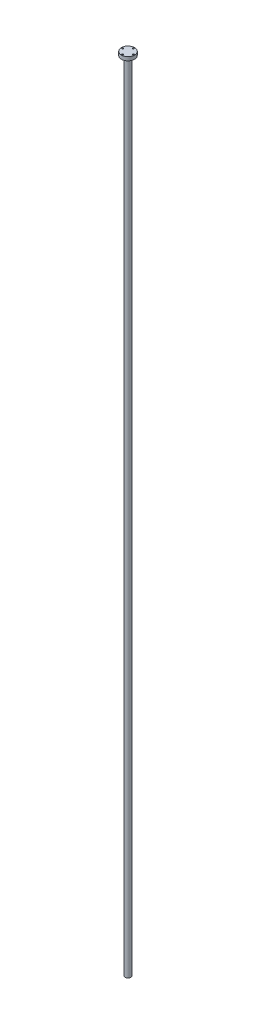
ISO-10303-21;
HEADER;
FILE_DESCRIPTION(('STEP AP214'),'2;1');
FILE_NAME('part.step','',(''),(''),'','','');
FILE_SCHEMA(('AUTOMOTIVE_DESIGN { 1 0 10303 214 1 1 1 1 }'));
ENDSEC;
DATA;
#1=APPLICATION_CONTEXT('core data for automotive mechanical design processes');
#2=APPLICATION_PROTOCOL_DEFINITION('international standard','automotive_design',2000,#1);
#3=PRODUCT_CONTEXT('',#1,'mechanical');
#4=PRODUCT('Part','Part','',(#3));
#5=PRODUCT_RELATED_PRODUCT_CATEGORY('part','',(#4));
#6=PRODUCT_DEFINITION_FORMATION('','',#4);
#7=PRODUCT_DEFINITION_CONTEXT('part definition',#1,'design');
#8=PRODUCT_DEFINITION('design','',#6,#7);
#9=PRODUCT_DEFINITION_SHAPE('','',#8);
#10=(LENGTH_UNIT() NAMED_UNIT(*) SI_UNIT(.MILLI.,.METRE.));
#11=(NAMED_UNIT(*) PLANE_ANGLE_UNIT() SI_UNIT($,.RADIAN.));
#12=(NAMED_UNIT(*) SI_UNIT($,.STERADIAN.) SOLID_ANGLE_UNIT());
#13=UNCERTAINTY_MEASURE_WITH_UNIT(LENGTH_MEASURE(1.E-05),#10,'distance_accuracy_value','');
#14=(GEOMETRIC_REPRESENTATION_CONTEXT(3) GLOBAL_UNCERTAINTY_ASSIGNED_CONTEXT((#13)) GLOBAL_UNIT_ASSIGNED_CONTEXT((#10,
#11,#12)) REPRESENTATION_CONTEXT('',''));
#15=CARTESIAN_POINT('',(0.,0.,0.));
#16=DIRECTION('',(0.,0.,1.));
#17=DIRECTION('',(1.,0.,0.));
#18=AXIS2_PLACEMENT_3D('',#15,#16,#17);
#19=CARTESIAN_POINT('',(0.,5.,0.));
#20=DIRECTION('',(0.,-1.,0.));
#21=DIRECTION('',(0.,0.,-1.));
#22=AXIS2_PLACEMENT_3D('',#19,#20,#21);
#23=CYLINDRICAL_SURFACE('',#22,9.);
#24=CARTESIAN_POINT('',(0.,5.,0.));
#25=DIRECTION('',(0.,1.,0.));
#26=DIRECTION('',(0.,0.,1.));
#27=AXIS2_PLACEMENT_3D('',#24,#25,#26);
#28=CIRCLE('',#27,9.);
#29=CARTESIAN_POINT('',(0.,5.,9.));
#30=VERTEX_POINT('',#29);
#31=EDGE_CURVE('E42',#30,#30,#28,.T.);
#32=ORIENTED_EDGE('',*,*,#31,.F.);
#33=EDGE_LOOP('',(#32));
#34=FACE_BOUND('',#33,.T.);
#35=CARTESIAN_POINT('',(0.,0.,0.));
#36=DIRECTION('',(0.,1.,0.));
#37=DIRECTION('',(0.,0.,1.));
#38=AXIS2_PLACEMENT_3D('',#35,#36,#37);
#39=CIRCLE('',#38,9.);
#40=CARTESIAN_POINT('',(0.,0.,9.));
#41=VERTEX_POINT('',#40);
#42=EDGE_CURVE('E90',#41,#41,#39,.T.);
#43=ORIENTED_EDGE('',*,*,#42,.T.);
#44=EDGE_LOOP('',(#43));
#45=FACE_BOUND('',#44,.T.);
#46=ADVANCED_FACE('F35',(#34,#45),#23,.T.);
#47=CARTESIAN_POINT('',(0.,5.,0.));
#48=DIRECTION('',(0.,1.,0.));
#49=DIRECTION('',(0.,0.,1.));
#50=AXIS2_PLACEMENT_3D('',#47,#48,#49);
#51=PLANE('',#50);
#52=CARTESIAN_POINT('',(0.,5.,-7.25));
#53=DIRECTION('',(0.,1.,0.));
#54=DIRECTION('',(0.,0.,1.));
#55=AXIS2_PLACEMENT_3D('',#52,#53,#54);
#56=CIRCLE('',#55,1.);
#57=CARTESIAN_POINT('',(0.,5.,-6.25));
#58=VERTEX_POINT('',#57);
#59=EDGE_CURVE('E83',#58,#58,#56,.T.);
#60=ORIENTED_EDGE('',*,*,#59,.F.);
#61=EDGE_LOOP('',(#60));
#62=FACE_BOUND('',#61,.T.);
#63=CARTESIAN_POINT('',(7.2500000000008,5.,-7.98481893651724E-13));
#64=DIRECTION('',(0.,1.,0.));
#65=DIRECTION('',(0.,0.,1.));
#66=AXIS2_PLACEMENT_3D('',#63,#64,#65);
#67=CIRCLE('',#66,1.00000000000002);
#68=CARTESIAN_POINT('',(7.2500000000008,5.,0.999999999999221));
#69=VERTEX_POINT('',#68);
#70=EDGE_CURVE('E91',#69,#69,#67,.T.);
#71=ORIENTED_EDGE('',*,*,#70,.F.);
#72=EDGE_LOOP('',(#71));
#73=FACE_BOUND('',#72,.T.);
#74=CARTESIAN_POINT('',(1.59696378730345E-12,5.,7.25));
#75=DIRECTION('',(0.,1.,0.));
#76=DIRECTION('',(0.,0.,1.));
#77=AXIS2_PLACEMENT_3D('',#74,#75,#76);
#78=CIRCLE('',#77,1.);
#79=CARTESIAN_POINT('',(1.59696378730345E-12,5.,8.25));
#80=VERTEX_POINT('',#79);
#81=EDGE_CURVE('E97',#80,#80,#78,.T.);
#82=ORIENTED_EDGE('',*,*,#81,.F.);
#83=EDGE_LOOP('',(#82));
#84=FACE_BOUND('',#83,.T.);
#85=CARTESIAN_POINT('',(-7.2499999999992,5.,7.99369762581106E-13));
#86=DIRECTION('',(0.,1.,0.));
#87=DIRECTION('',(0.,0.,1.));
#88=AXIS2_PLACEMENT_3D('',#85,#86,#87);
#89=CIRCLE('',#88,1.);
#90=CARTESIAN_POINT('',(-7.2499999999992,5.,1.0000000000008));
#91=VERTEX_POINT('',#90);
#92=EDGE_CURVE('E82',#91,#91,#89,.T.);
#93=ORIENTED_EDGE('',*,*,#92,.F.);
#94=EDGE_LOOP('',(#93));
#95=FACE_BOUND('',#94,.T.);
#96=ORIENTED_EDGE('',*,*,#31,.T.);
#97=EDGE_LOOP('',(#96));
#98=FACE_BOUND('',#97,.T.);
#99=ADVANCED_FACE('F115',(#62,#73,#84,#95,#98),#51,.T.);
#100=CARTESIAN_POINT('',(0.,0.,0.));
#101=DIRECTION('',(0.,1.,0.));
#102=DIRECTION('',(0.,0.,1.));
#103=AXIS2_PLACEMENT_3D('',#100,#101,#102);
#104=PLANE('',#103);
#105=CARTESIAN_POINT('',(0.,0.,0.));
#106=DIRECTION('',(0.,1.,0.));
#107=DIRECTION('',(0.,0.,1.));
#108=AXIS2_PLACEMENT_3D('',#105,#106,#107);
#109=CIRCLE('',#108,4.);
#110=CARTESIAN_POINT('',(0.,0.,4.));
#111=VERTEX_POINT('',#110);
#112=EDGE_CURVE('E11',#111,#111,#109,.F.);
#113=ORIENTED_EDGE('',*,*,#112,.F.);
#114=EDGE_LOOP('',(#113));
#115=FACE_BOUND('',#114,.T.);
#116=CARTESIAN_POINT('',(0.,0.,-7.25));
#117=DIRECTION('',(0.,1.,0.));
#118=DIRECTION('',(0.,0.,1.));
#119=AXIS2_PLACEMENT_3D('',#116,#117,#118);
#120=CIRCLE('',#119,1.);
#121=CARTESIAN_POINT('',(0.,0.,-6.25));
#122=VERTEX_POINT('',#121);
#123=EDGE_CURVE('E86',#122,#122,#120,.F.);
#124=ORIENTED_EDGE('',*,*,#123,.F.);
#125=EDGE_LOOP('',(#124));
#126=FACE_BOUND('',#125,.T.);
#127=CARTESIAN_POINT('',(7.2500000000008,0.,-7.98481893651724E-13));
#128=DIRECTION('',(0.,1.,0.));
#129=DIRECTION('',(0.,0.,1.));
#130=AXIS2_PLACEMENT_3D('',#127,#128,#129);
#131=CIRCLE('',#130,1.00000000000002);
#132=CARTESIAN_POINT('',(7.2500000000008,0.,0.999999999999221));
#133=VERTEX_POINT('',#132);
#134=EDGE_CURVE('E87',#133,#133,#131,.F.);
#135=ORIENTED_EDGE('',*,*,#134,.F.);
#136=EDGE_LOOP('',(#135));
#137=FACE_BOUND('',#136,.T.);
#138=CARTESIAN_POINT('',(1.59696378730345E-12,0.,7.25));
#139=DIRECTION('',(0.,1.,0.));
#140=DIRECTION('',(0.,0.,1.));
#141=AXIS2_PLACEMENT_3D('',#138,#139,#140);
#142=CIRCLE('',#141,1.);
#143=CARTESIAN_POINT('',(1.59696378730345E-12,0.,8.25));
#144=VERTEX_POINT('',#143);
#145=EDGE_CURVE('E94',#144,#144,#142,.F.);
#146=ORIENTED_EDGE('',*,*,#145,.F.);
#147=EDGE_LOOP('',(#146));
#148=FACE_BOUND('',#147,.T.);
#149=CARTESIAN_POINT('',(-7.2499999999992,0.,7.99369762581106E-13));
#150=DIRECTION('',(0.,1.,0.));
#151=DIRECTION('',(0.,0.,1.));
#152=AXIS2_PLACEMENT_3D('',#149,#150,#151);
#153=CIRCLE('',#152,1.);
#154=CARTESIAN_POINT('',(-7.2499999999992,0.,1.0000000000008));
#155=VERTEX_POINT('',#154);
#156=EDGE_CURVE('E100',#155,#155,#153,.F.);
#157=ORIENTED_EDGE('',*,*,#156,.F.);
#158=EDGE_LOOP('',(#157));
#159=FACE_BOUND('',#158,.T.);
#160=ORIENTED_EDGE('',*,*,#42,.F.);
#161=EDGE_LOOP('',(#160));
#162=FACE_BOUND('',#161,.T.);
#163=ADVANCED_FACE('F112',(#115,#126,#137,#148,#159,#162),#104,.F.);
#164=CARTESIAN_POINT('',(-7.2499999999992,-2.82842712474624,7.99369762581106E-13));
#165=DIRECTION('',(0.,1.,0.));
#166=DIRECTION('',(0.,0.,1.));
#167=AXIS2_PLACEMENT_3D('',#164,#165,#166);
#168=CYLINDRICAL_SURFACE('',#167,1.);
#169=ORIENTED_EDGE('',*,*,#156,.T.);
#170=EDGE_LOOP('',(#169));
#171=FACE_BOUND('',#170,.T.);
#172=ORIENTED_EDGE('',*,*,#92,.T.);
#173=EDGE_LOOP('',(#172));
#174=FACE_BOUND('',#173,.T.);
#175=ADVANCED_FACE('F114',(#171,#174),#168,.F.);
#176=CARTESIAN_POINT('',(1.59696378730345E-12,-2.82842712474624,7.25));
#177=DIRECTION('',(0.,1.,0.));
#178=DIRECTION('',(0.,0.,1.));
#179=AXIS2_PLACEMENT_3D('',#176,#177,#178);
#180=CYLINDRICAL_SURFACE('',#179,1.);
#181=ORIENTED_EDGE('',*,*,#145,.T.);
#182=EDGE_LOOP('',(#181));
#183=FACE_BOUND('',#182,.T.);
#184=ORIENTED_EDGE('',*,*,#81,.T.);
#185=EDGE_LOOP('',(#184));
#186=FACE_BOUND('',#185,.T.);
#187=ADVANCED_FACE('F121',(#183,#186),#180,.F.);
#188=CARTESIAN_POINT('',(7.2500000000008,-2.82842712474624,-7.98481893651724E-13));
#189=DIRECTION('',(0.,1.,0.));
#190=DIRECTION('',(0.,0.,1.));
#191=AXIS2_PLACEMENT_3D('',#188,#189,#190);
#192=CYLINDRICAL_SURFACE('',#191,1.00000000000002);
#193=ORIENTED_EDGE('',*,*,#134,.T.);
#194=EDGE_LOOP('',(#193));
#195=FACE_BOUND('',#194,.T.);
#196=ORIENTED_EDGE('',*,*,#70,.T.);
#197=EDGE_LOOP('',(#196));
#198=FACE_BOUND('',#197,.T.);
#199=ADVANCED_FACE('F154',(#195,#198),#192,.F.);
#200=CARTESIAN_POINT('',(0.,-2.82842712474624,-7.25));
#201=DIRECTION('',(0.,1.,0.));
#202=DIRECTION('',(0.,0.,1.));
#203=AXIS2_PLACEMENT_3D('',#200,#201,#202);
#204=CYLINDRICAL_SURFACE('',#203,1.);
#205=ORIENTED_EDGE('',*,*,#123,.T.);
#206=EDGE_LOOP('',(#205));
#207=FACE_BOUND('',#206,.T.);
#208=ORIENTED_EDGE('',*,*,#59,.T.);
#209=EDGE_LOOP('',(#208));
#210=FACE_BOUND('',#209,.T.);
#211=ADVANCED_FACE('F164',(#207,#210),#204,.F.);
#212=CARTESIAN_POINT('',(0.,-1094.,0.));
#213=DIRECTION('',(0.,1.,0.));
#214=DIRECTION('',(0.,0.,1.));
#215=AXIS2_PLACEMENT_3D('',#212,#213,#214);
#216=CYLINDRICAL_SURFACE('',#215,4.);
#217=CARTESIAN_POINT('',(0.,-1094.,0.));
#218=DIRECTION('',(0.,-1.,0.));
#219=DIRECTION('',(0.,0.,-1.));
#220=AXIS2_PLACEMENT_3D('',#217,#218,#219);
#221=CIRCLE('',#220,4.);
#222=CARTESIAN_POINT('',(0.,-1094.,-4.));
#223=VERTEX_POINT('',#222);
#224=EDGE_CURVE('E79',#223,#223,#221,.T.);
#225=ORIENTED_EDGE('',*,*,#224,.F.);
#226=EDGE_LOOP('',(#225));
#227=FACE_BOUND('',#226,.T.);
#228=ORIENTED_EDGE('',*,*,#112,.T.);
#229=EDGE_LOOP('',(#228));
#230=FACE_BOUND('',#229,.T.);
#231=ADVANCED_FACE('F173',(#227,#230),#216,.T.);
#232=CARTESIAN_POINT('',(0.,-1094.,0.));
#233=DIRECTION('',(0.,-1.,0.));
#234=DIRECTION('',(0.,0.,-1.));
#235=AXIS2_PLACEMENT_3D('',#232,#233,#234);
#236=PLANE('',#235);
#237=DIRECTION('',(0.,0.,1.));
#238=VECTOR('',#237,1.);
#239=CARTESIAN_POINT('',(1.92,-1094.,1.75316856006489));
#240=LINE('',#239,#238);
#241=CARTESIAN_POINT('',(1.92,-1094.,-1.75316856006489));
#242=VERTEX_POINT('',#241);
#243=CARTESIAN_POINT('',(1.92,-1094.,1.75316856006489));
#244=VERTEX_POINT('',#243);
#245=EDGE_CURVE('E49',#242,#244,#240,.T.);
#246=ORIENTED_EDGE('',*,*,#245,.F.);
#247=CARTESIAN_POINT('',(0.,-1094.,0.));
#248=DIRECTION('',(0.,-1.,0.));
#249=DIRECTION('',(0.,0.,-1.));
#250=AXIS2_PLACEMENT_3D('',#247,#248,#249);
#251=CIRCLE('',#250,2.6);
#252=EDGE_CURVE('E74',#244,#242,#251,.T.);
#253=ORIENTED_EDGE('',*,*,#252,.F.);
#254=EDGE_LOOP('',(#246,#253));
#255=FACE_BOUND('',#254,.T.);
#256=ORIENTED_EDGE('',*,*,#224,.T.);
#257=EDGE_LOOP('',(#256));
#258=FACE_BOUND('',#257,.T.);
#259=ADVANCED_FACE('F187',(#255,#258),#236,.T.);
#260=CARTESIAN_POINT('',(0.,0.,0.));
#261=DIRECTION('',(0.,1.,0.));
#262=DIRECTION('',(0.,0.,1.));
#263=AXIS2_PLACEMENT_3D('',#260,#261,#262);
#264=PLANE('',#263);
#265=CARTESIAN_POINT('',(0.,0.,0.));
#266=DIRECTION('',(0.,1.,0.));
#267=DIRECTION('',(0.,0.,1.));
#268=AXIS2_PLACEMENT_3D('',#265,#266,#267);
#269=CIRCLE('',#268,2.6);
#270=CARTESIAN_POINT('',(1.92,0.,1.75316856006489));
#271=VERTEX_POINT('',#270);
#272=CARTESIAN_POINT('',(1.92,0.,-1.75316856006489));
#273=VERTEX_POINT('',#272);
#274=EDGE_CURVE('E62',#271,#273,#269,.F.);
#275=ORIENTED_EDGE('',*,*,#274,.T.);
#276=DIRECTION('',(0.,0.,1.));
#277=VECTOR('',#276,1.);
#278=CARTESIAN_POINT('',(1.92,0.,1.75316856006489));
#279=LINE('',#278,#277);
#280=EDGE_CURVE('E70',#273,#271,#279,.T.);
#281=ORIENTED_EDGE('',*,*,#280,.T.);
#282=EDGE_LOOP('',(#275,#281));
#283=FACE_BOUND('',#282,.T.);
#284=ADVANCED_FACE('F72',(#283),#264,.F.);
#285=CARTESIAN_POINT('',(1.92,6.88987663169671,1.75316856006489));
#286=DIRECTION('',(1.,0.,0.));
#287=DIRECTION('',(0.,0.,-1.));
#288=AXIS2_PLACEMENT_3D('',#285,#286,#287);
#289=PLANE('',#288);
#290=DIRECTION('',(0.,-1.,0.));
#291=VECTOR('',#290,1.);
#292=CARTESIAN_POINT('',(1.92,6.88987663169671,-1.75316856006489));
#293=LINE('',#292,#291);
#294=EDGE_CURVE('E55',#273,#242,#293,.T.);
#295=ORIENTED_EDGE('',*,*,#294,.T.);
#296=ORIENTED_EDGE('',*,*,#245,.T.);
#297=DIRECTION('',(0.,-1.,0.));
#298=VECTOR('',#297,1.);
#299=CARTESIAN_POINT('',(1.92,6.88987663169671,1.75316856006489));
#300=LINE('',#299,#298);
#301=EDGE_CURVE('E64',#271,#244,#300,.T.);
#302=ORIENTED_EDGE('',*,*,#301,.F.);
#303=ORIENTED_EDGE('',*,*,#280,.F.);
#304=EDGE_LOOP('',(#295,#296,#302,#303));
#305=FACE_BOUND('',#304,.T.);
#306=ADVANCED_FACE('F69',(#305),#289,.F.);
#307=CARTESIAN_POINT('',(0.,6.88987663169671,0.));
#308=DIRECTION('',(0.,-1.,0.));
#309=DIRECTION('',(0.,0.,-1.));
#310=AXIS2_PLACEMENT_3D('',#307,#308,#309);
#311=CYLINDRICAL_SURFACE('',#310,2.6);
#312=ORIENTED_EDGE('',*,*,#301,.T.);
#313=ORIENTED_EDGE('',*,*,#252,.T.);
#314=ORIENTED_EDGE('',*,*,#294,.F.);
#315=ORIENTED_EDGE('',*,*,#274,.F.);
#316=EDGE_LOOP('',(#312,#313,#314,#315));
#317=FACE_BOUND('',#316,.T.);
#318=ADVANCED_FACE('F63',(#317),#311,.F.);
#319=CLOSED_SHELL('',(#46,#99,#163,#175,#187,#199,#211,#231,#259,#284,#306,#318));
#320=MANIFOLD_SOLID_BREP('B2',#319);
#321=ADVANCED_BREP_SHAPE_REPRESENTATION('',(#18,#320),#14);
#322=SHAPE_DEFINITION_REPRESENTATION(#9,#321);
ENDSEC;
END-ISO-10303-21;
